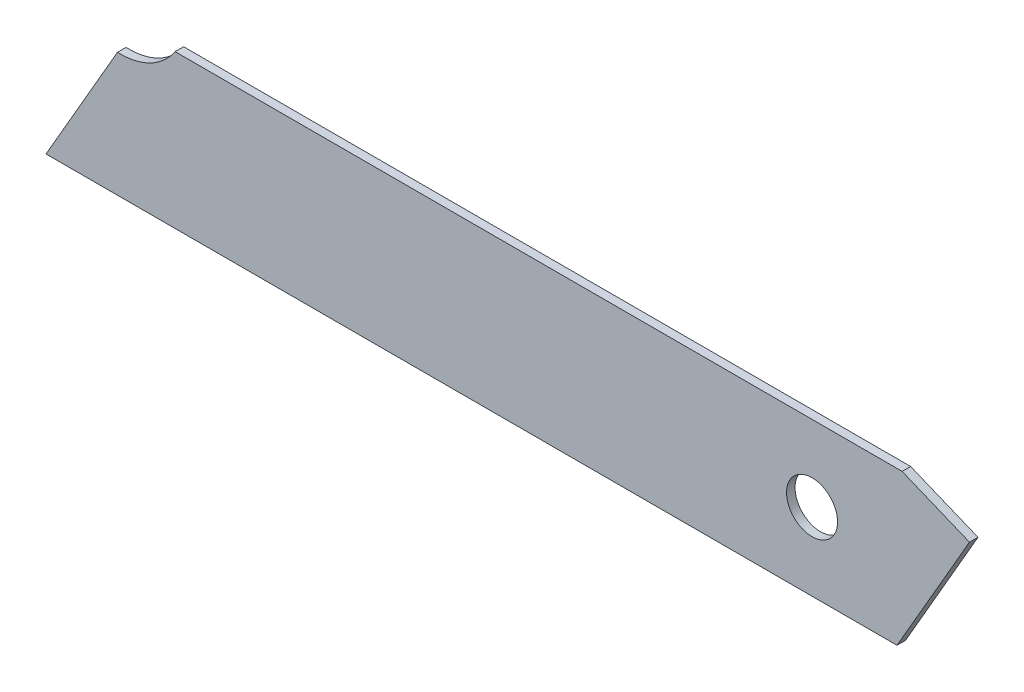
ISO-10303-21;
HEADER;
FILE_DESCRIPTION(('STEP AP214'),'2;1');
FILE_NAME('part.step','',(''),(''),'','','');
FILE_SCHEMA(('AUTOMOTIVE_DESIGN { 1 0 10303 214 1 1 1 1 }'));
ENDSEC;
DATA;
#1=APPLICATION_CONTEXT('core data for automotive mechanical design processes');
#2=APPLICATION_PROTOCOL_DEFINITION('international standard','automotive_design',2000,#1);
#3=PRODUCT_CONTEXT('',#1,'mechanical');
#4=PRODUCT('Part','Part','',(#3));
#5=PRODUCT_RELATED_PRODUCT_CATEGORY('part','',(#4));
#6=PRODUCT_DEFINITION_FORMATION('','',#4);
#7=PRODUCT_DEFINITION_CONTEXT('part definition',#1,'design');
#8=PRODUCT_DEFINITION('design','',#6,#7);
#9=PRODUCT_DEFINITION_SHAPE('','',#8);
#10=(LENGTH_UNIT() NAMED_UNIT(*) SI_UNIT(.MILLI.,.METRE.));
#11=(NAMED_UNIT(*) PLANE_ANGLE_UNIT() SI_UNIT($,.RADIAN.));
#12=(NAMED_UNIT(*) SI_UNIT($,.STERADIAN.) SOLID_ANGLE_UNIT());
#13=UNCERTAINTY_MEASURE_WITH_UNIT(LENGTH_MEASURE(1.E-05),#10,'distance_accuracy_value','');
#14=(GEOMETRIC_REPRESENTATION_CONTEXT(3) GLOBAL_UNCERTAINTY_ASSIGNED_CONTEXT((#13)) GLOBAL_UNIT_ASSIGNED_CONTEXT((#10,
#11,#12)) REPRESENTATION_CONTEXT('',''));
#15=CARTESIAN_POINT('',(0.,0.,0.));
#16=DIRECTION('',(0.,0.,1.));
#17=DIRECTION('',(1.,0.,0.));
#18=AXIS2_PLACEMENT_3D('',#15,#16,#17);
#19=CARTESIAN_POINT('',(8.75907132230756,22.2036656745929,1.));
#20=DIRECTION('',(0.,0.,-1.));
#21=DIRECTION('',(-1.,0.,0.));
#22=AXIS2_PLACEMENT_3D('',#19,#20,#21);
#23=CYLINDRICAL_SURFACE('',#22,7.66373091886147);
#24=CARTESIAN_POINT('',(8.75907132230756,22.2036656745929,0.));
#25=DIRECTION('',(0.,0.,1.));
#26=DIRECTION('',(1.,0.,0.));
#27=AXIS2_PLACEMENT_3D('',#24,#25,#26);
#28=CIRCLE('',#27,7.66373091886147);
#29=CARTESIAN_POINT('',(8.39950783110011,14.5483743220379,0.));
#30=VERTEX_POINT('',#29);
#31=CARTESIAN_POINT('',(15.1670325029767,18.,0.));
#32=VERTEX_POINT('',#31);
#33=EDGE_CURVE('E134',#30,#32,#28,.T.);
#34=ORIENTED_EDGE('',*,*,#33,.F.);
#35=DIRECTION('',(0.,0.,-1.));
#36=VECTOR('',#35,1.);
#37=CARTESIAN_POINT('',(8.39950783110011,14.5483743220379,1.));
#38=LINE('',#37,#36);
#39=CARTESIAN_POINT('',(8.39950783110011,14.5483743220379,1.));
#40=VERTEX_POINT('',#39);
#41=EDGE_CURVE('E11',#40,#30,#38,.T.);
#42=ORIENTED_EDGE('',*,*,#41,.F.);
#43=CARTESIAN_POINT('',(8.75907132230756,22.2036656745929,1.));
#44=DIRECTION('',(0.,0.,1.));
#45=DIRECTION('',(1.,0.,0.));
#46=AXIS2_PLACEMENT_3D('',#43,#44,#45);
#47=CIRCLE('',#46,7.66373091886147);
#48=CARTESIAN_POINT('',(15.1670325029767,18.,1.));
#49=VERTEX_POINT('',#48);
#50=EDGE_CURVE('E196',#40,#49,#47,.T.);
#51=ORIENTED_EDGE('',*,*,#50,.T.);
#52=DIRECTION('',(0.,0.,-1.));
#53=VECTOR('',#52,1.);
#54=CARTESIAN_POINT('',(15.1670325029767,18.,1.));
#55=LINE('',#54,#53);
#56=EDGE_CURVE('E61',#49,#32,#55,.T.);
#57=ORIENTED_EDGE('',*,*,#56,.T.);
#58=EDGE_LOOP('',(#34,#42,#51,#57));
#59=FACE_BOUND('',#58,.T.);
#60=ADVANCED_FACE('F43',(#59),#23,.F.);
#61=CARTESIAN_POINT('',(0.,0.,1.));
#62=DIRECTION('',(0.866025403784436,-0.500000000000004,0.));
#63=DIRECTION('',(0.500000000000004,0.866025403784436,0.));
#64=AXIS2_PLACEMENT_3D('',#61,#62,#63);
#65=PLANE('',#64);
#66=DIRECTION('',(-0.500000000000004,-0.866025403784436,0.));
#67=VECTOR('',#66,1.);
#68=CARTESIAN_POINT('',(0.,0.,0.));
#69=LINE('',#68,#67);
#70=CARTESIAN_POINT('',(0.,0.,0.));
#71=VERTEX_POINT('',#70);
#72=EDGE_CURVE('E137',#30,#71,#69,.T.);
#73=ORIENTED_EDGE('',*,*,#72,.T.);
#74=DIRECTION('',(0.,0.,-1.));
#75=VECTOR('',#74,1.);
#76=CARTESIAN_POINT('',(0.,0.,1.));
#77=LINE('',#76,#75);
#78=CARTESIAN_POINT('',(0.,0.,1.));
#79=VERTEX_POINT('',#78);
#80=EDGE_CURVE('E53',#79,#71,#77,.T.);
#81=ORIENTED_EDGE('',*,*,#80,.F.);
#82=DIRECTION('',(-0.500000000000004,-0.866025403784436,0.));
#83=VECTOR('',#82,1.);
#84=CARTESIAN_POINT('',(0.,0.,1.));
#85=LINE('',#84,#83);
#86=EDGE_CURVE('E199',#40,#79,#85,.T.);
#87=ORIENTED_EDGE('',*,*,#86,.F.);
#88=ORIENTED_EDGE('',*,*,#41,.T.);
#89=EDGE_LOOP('',(#73,#81,#87,#88));
#90=FACE_BOUND('',#89,.T.);
#91=ADVANCED_FACE('F167',(#90),#65,.F.);
#92=CARTESIAN_POINT('',(0.,0.,1.));
#93=DIRECTION('',(0.,1.,0.));
#94=DIRECTION('',(0.,0.,1.));
#95=AXIS2_PLACEMENT_3D('',#92,#93,#94);
#96=PLANE('',#95);
#97=DIRECTION('',(1.,0.,0.));
#98=VECTOR('',#97,1.);
#99=CARTESIAN_POINT('',(0.,0.,0.));
#100=LINE('',#99,#98);
#101=CARTESIAN_POINT('',(100.,0.,0.));
#102=VERTEX_POINT('',#101);
#103=EDGE_CURVE('E141',#71,#102,#100,.T.);
#104=ORIENTED_EDGE('',*,*,#103,.T.);
#105=DIRECTION('',(0.,0.,-1.));
#106=VECTOR('',#105,1.);
#107=CARTESIAN_POINT('',(100.,0.,1.));
#108=LINE('',#107,#106);
#109=CARTESIAN_POINT('',(100.,0.,1.));
#110=VERTEX_POINT('',#109);
#111=EDGE_CURVE('E109',#110,#102,#108,.T.);
#112=ORIENTED_EDGE('',*,*,#111,.F.);
#113=DIRECTION('',(1.,0.,0.));
#114=VECTOR('',#113,1.);
#115=CARTESIAN_POINT('',(0.,0.,1.));
#116=LINE('',#115,#114);
#117=EDGE_CURVE('E118',#79,#110,#116,.T.);
#118=ORIENTED_EDGE('',*,*,#117,.F.);
#119=ORIENTED_EDGE('',*,*,#80,.T.);
#120=EDGE_LOOP('',(#104,#112,#118,#119));
#121=FACE_BOUND('',#120,.T.);
#122=ADVANCED_FACE('F164',(#121),#96,.F.);
#123=CARTESIAN_POINT('',(74.9999999999996,-43.3012701892222,1.));
#124=DIRECTION('',(0.866025403784436,-0.500000000000004,0.));
#125=DIRECTION('',(0.500000000000004,0.866025403784436,0.));
#126=AXIS2_PLACEMENT_3D('',#123,#124,#125);
#127=PLANE('',#126);
#128=DIRECTION('',(-0.500000000000004,-0.866025403784436,0.));
#129=VECTOR('',#128,1.);
#130=CARTESIAN_POINT('',(74.9999999999996,-43.3012701892222,0.));
#131=LINE('',#130,#129);
#132=CARTESIAN_POINT('',(108.516319796617,14.7506985812446,0.));
#133=VERTEX_POINT('',#132);
#134=EDGE_CURVE('E104',#133,#102,#131,.T.);
#135=ORIENTED_EDGE('',*,*,#134,.F.);
#136=DIRECTION('',(0.,0.,-1.));
#137=VECTOR('',#136,1.);
#138=CARTESIAN_POINT('',(108.516319796617,14.7506985812446,1.));
#139=LINE('',#138,#137);
#140=CARTESIAN_POINT('',(108.516319796617,14.7506985812446,1.));
#141=VERTEX_POINT('',#140);
#142=EDGE_CURVE('E99',#141,#133,#139,.T.);
#143=ORIENTED_EDGE('',*,*,#142,.F.);
#144=DIRECTION('',(-0.500000000000004,-0.866025403784436,0.));
#145=VECTOR('',#144,1.);
#146=CARTESIAN_POINT('',(74.9999999999996,-43.3012701892222,1.));
#147=LINE('',#146,#145);
#148=EDGE_CURVE('E102',#141,#110,#147,.T.);
#149=ORIENTED_EDGE('',*,*,#148,.T.);
#150=ORIENTED_EDGE('',*,*,#111,.T.);
#151=EDGE_LOOP('',(#135,#143,#149,#150));
#152=FACE_BOUND('',#151,.T.);
#153=ADVANCED_FACE('F101',(#152),#127,.T.);
#154=CARTESIAN_POINT('',(20.8330924539564,50.7470976880481,1.));
#155=DIRECTION('',(0.379771205384317,0.925080445994262,0.));
#156=DIRECTION('',(-0.925080445994262,0.379771205384317,0.));
#157=AXIS2_PLACEMENT_3D('',#154,#155,#156);
#158=PLANE('',#157);
#159=DIRECTION('',(0.925080445994262,-0.379771205384317,0.));
#160=VECTOR('',#159,1.);
#161=CARTESIAN_POINT('',(20.8330924539564,50.7470976880481,0.));
#162=LINE('',#161,#160);
#163=CARTESIAN_POINT('',(100.601382689707,18.,0.));
#164=VERTEX_POINT('',#163);
#165=EDGE_CURVE('E147',#164,#133,#162,.T.);
#166=ORIENTED_EDGE('',*,*,#165,.F.);
#167=DIRECTION('',(0.,0.,-1.));
#168=VECTOR('',#167,1.);
#169=CARTESIAN_POINT('',(100.601382689707,18.,1.));
#170=LINE('',#169,#168);
#171=CARTESIAN_POINT('',(100.601382689707,18.,1.));
#172=VERTEX_POINT('',#171);
#173=EDGE_CURVE('E80',#172,#164,#170,.T.);
#174=ORIENTED_EDGE('',*,*,#173,.F.);
#175=DIRECTION('',(0.925080445994262,-0.379771205384317,0.));
#176=VECTOR('',#175,1.);
#177=CARTESIAN_POINT('',(20.8330924539564,50.7470976880481,1.));
#178=LINE('',#177,#176);
#179=EDGE_CURVE('E116',#172,#141,#178,.T.);
#180=ORIENTED_EDGE('',*,*,#179,.T.);
#181=ORIENTED_EDGE('',*,*,#142,.T.);
#182=EDGE_LOOP('',(#166,#174,#180,#181));
#183=FACE_BOUND('',#182,.T.);
#184=ADVANCED_FACE('F122',(#183),#158,.T.);
#185=CARTESIAN_POINT('',(90.0158098237167,9.06195857975742,1.));
#186=DIRECTION('',(0.,0.,-1.));
#187=DIRECTION('',(-1.,0.,0.));
#188=AXIS2_PLACEMENT_3D('',#185,#186,#187);
#189=CYLINDRICAL_SURFACE('',#188,3.00000000000001);
#190=CARTESIAN_POINT('',(90.0158098237167,9.06195857975742,1.));
#191=DIRECTION('',(0.,0.,1.));
#192=DIRECTION('',(1.,0.,0.));
#193=AXIS2_PLACEMENT_3D('',#190,#191,#192);
#194=CIRCLE('',#193,3.00000000000001);
#195=CARTESIAN_POINT('',(93.0158098237167,9.06195857975742,1.));
#196=VERTEX_POINT('',#195);
#197=EDGE_CURVE('E154',#196,#196,#194,.T.);
#198=ORIENTED_EDGE('',*,*,#197,.T.);
#199=EDGE_LOOP('',(#198));
#200=FACE_BOUND('',#199,.T.);
#201=CARTESIAN_POINT('',(90.0158098237167,9.06195857975742,0.));
#202=DIRECTION('',(0.,0.,1.));
#203=DIRECTION('',(1.,0.,0.));
#204=AXIS2_PLACEMENT_3D('',#201,#202,#203);
#205=CIRCLE('',#204,3.00000000000001);
#206=CARTESIAN_POINT('',(93.0158098237167,9.06195857975742,0.));
#207=VERTEX_POINT('',#206);
#208=EDGE_CURVE('E130',#207,#207,#205,.T.);
#209=ORIENTED_EDGE('',*,*,#208,.F.);
#210=EDGE_LOOP('',(#209));
#211=FACE_BOUND('',#210,.T.);
#212=ADVANCED_FACE('F45',(#200,#211),#189,.F.);
#213=CARTESIAN_POINT('',(0.,18.,1.));
#214=DIRECTION('',(0.,1.,0.));
#215=DIRECTION('',(0.,0.,1.));
#216=AXIS2_PLACEMENT_3D('',#213,#214,#215);
#217=PLANE('',#216);
#218=DIRECTION('',(1.,0.,0.));
#219=VECTOR('',#218,1.);
#220=CARTESIAN_POINT('',(0.,18.,0.));
#221=LINE('',#220,#219);
#222=EDGE_CURVE('E150',#32,#164,#221,.T.);
#223=ORIENTED_EDGE('',*,*,#222,.F.);
#224=ORIENTED_EDGE('',*,*,#56,.F.);
#225=DIRECTION('',(1.,0.,0.));
#226=VECTOR('',#225,1.);
#227=CARTESIAN_POINT('',(0.,18.,1.));
#228=LINE('',#227,#226);
#229=EDGE_CURVE('E124',#49,#172,#228,.T.);
#230=ORIENTED_EDGE('',*,*,#229,.T.);
#231=ORIENTED_EDGE('',*,*,#173,.T.);
#232=EDGE_LOOP('',(#223,#224,#230,#231));
#233=FACE_BOUND('',#232,.T.);
#234=ADVANCED_FACE('F182',(#233),#217,.T.);
#235=CARTESIAN_POINT('',(0.,0.,1.));
#236=DIRECTION('',(0.,0.,1.));
#237=DIRECTION('',(1.,0.,0.));
#238=AXIS2_PLACEMENT_3D('',#235,#236,#237);
#239=PLANE('',#238);
#240=ORIENTED_EDGE('',*,*,#197,.F.);
#241=EDGE_LOOP('',(#240));
#242=FACE_BOUND('',#241,.T.);
#243=ORIENTED_EDGE('',*,*,#50,.F.);
#244=ORIENTED_EDGE('',*,*,#86,.T.);
#245=ORIENTED_EDGE('',*,*,#117,.T.);
#246=ORIENTED_EDGE('',*,*,#148,.F.);
#247=ORIENTED_EDGE('',*,*,#179,.F.);
#248=ORIENTED_EDGE('',*,*,#229,.F.);
#249=EDGE_LOOP('',(#243,#244,#245,#246,#247,#248));
#250=FACE_BOUND('',#249,.T.);
#251=ADVANCED_FACE('F114',(#242,#250),#239,.T.);
#252=CARTESIAN_POINT('',(0.,0.,0.));
#253=DIRECTION('',(0.,0.,1.));
#254=DIRECTION('',(1.,0.,0.));
#255=AXIS2_PLACEMENT_3D('',#252,#253,#254);
#256=PLANE('',#255);
#257=ORIENTED_EDGE('',*,*,#208,.T.);
#258=EDGE_LOOP('',(#257));
#259=FACE_BOUND('',#258,.T.);
#260=ORIENTED_EDGE('',*,*,#33,.T.);
#261=ORIENTED_EDGE('',*,*,#222,.T.);
#262=ORIENTED_EDGE('',*,*,#165,.T.);
#263=ORIENTED_EDGE('',*,*,#134,.T.);
#264=ORIENTED_EDGE('',*,*,#103,.F.);
#265=ORIENTED_EDGE('',*,*,#72,.F.);
#266=EDGE_LOOP('',(#260,#261,#262,#263,#264,#265));
#267=FACE_BOUND('',#266,.T.);
#268=ADVANCED_FACE('F169',(#259,#267),#256,.F.);
#269=CLOSED_SHELL('',(#60,#91,#122,#153,#184,#212,#234,#251,#268));
#270=MANIFOLD_SOLID_BREP('B2',#269);
#271=ADVANCED_BREP_SHAPE_REPRESENTATION('',(#18,#270),#14);
#272=SHAPE_DEFINITION_REPRESENTATION(#9,#271);
ENDSEC;
END-ISO-10303-21;
